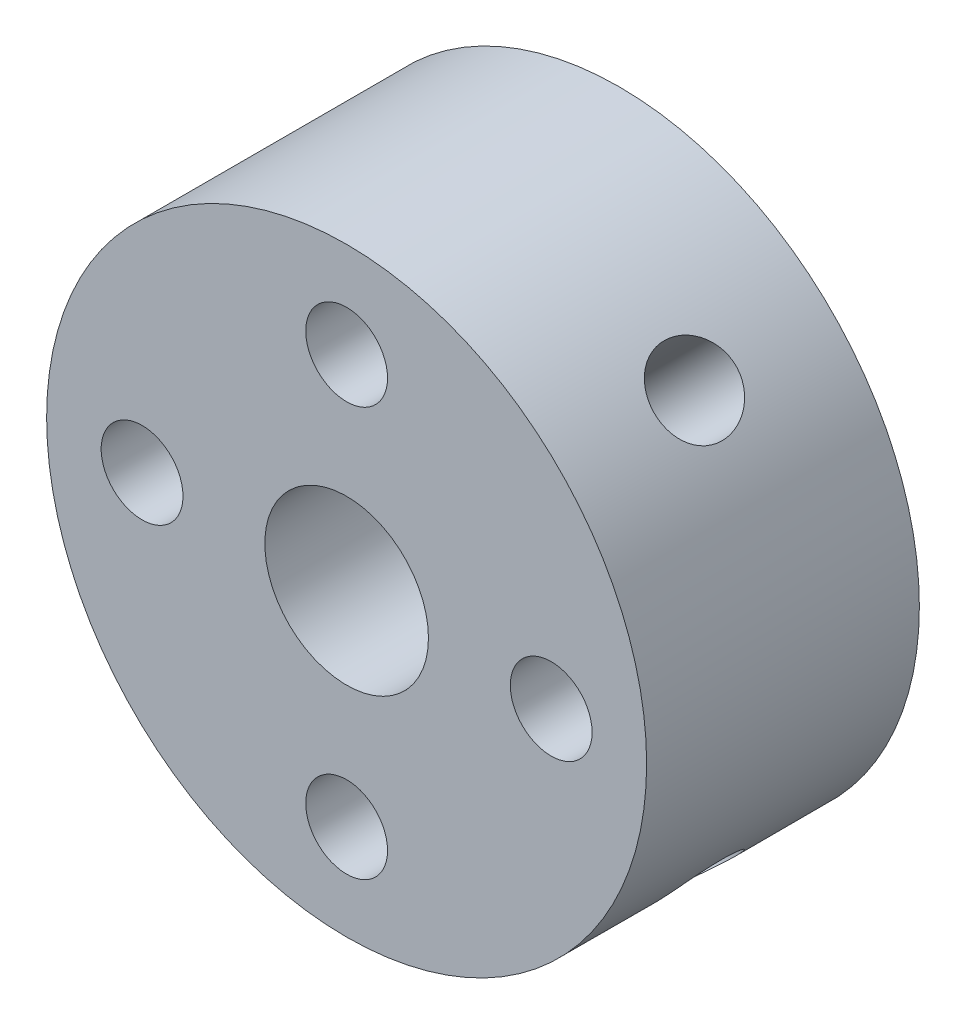
ISO-10303-21;
HEADER;
FILE_DESCRIPTION(('STEP AP214'),'2;1');
FILE_NAME('part.step','',(''),(''),'','','');
FILE_SCHEMA(('AUTOMOTIVE_DESIGN { 1 0 10303 214 1 1 1 1 }'));
ENDSEC;
DATA;
#1=APPLICATION_CONTEXT('core data for automotive mechanical design processes');
#2=APPLICATION_PROTOCOL_DEFINITION('international standard','automotive_design',2000,#1);
#3=PRODUCT_CONTEXT('',#1,'mechanical');
#4=PRODUCT('Part','Part','',(#3));
#5=PRODUCT_RELATED_PRODUCT_CATEGORY('part','',(#4));
#6=PRODUCT_DEFINITION_FORMATION('','',#4);
#7=PRODUCT_DEFINITION_CONTEXT('part definition',#1,'design');
#8=PRODUCT_DEFINITION('design','',#6,#7);
#9=PRODUCT_DEFINITION_SHAPE('','',#8);
#10=(LENGTH_UNIT() NAMED_UNIT(*) SI_UNIT(.MILLI.,.METRE.));
#11=(NAMED_UNIT(*) PLANE_ANGLE_UNIT() SI_UNIT($,.RADIAN.));
#12=(NAMED_UNIT(*) SI_UNIT($,.STERADIAN.) SOLID_ANGLE_UNIT());
#13=UNCERTAINTY_MEASURE_WITH_UNIT(LENGTH_MEASURE(1.E-05),#10,'distance_accuracy_value','');
#14=(GEOMETRIC_REPRESENTATION_CONTEXT(3) GLOBAL_UNCERTAINTY_ASSIGNED_CONTEXT((#13)) GLOBAL_UNIT_ASSIGNED_CONTEXT((#10,
#11,#12)) REPRESENTATION_CONTEXT('',''));
#15=CARTESIAN_POINT('',(0.,0.,0.));
#16=DIRECTION('',(0.,0.,1.));
#17=DIRECTION('',(1.,0.,0.));
#18=AXIS2_PLACEMENT_3D('',#15,#16,#17);
#19=CARTESIAN_POINT('',(0.,0.,10.));
#20=DIRECTION('',(0.,0.,-1.));
#21=DIRECTION('',(-1.,0.,0.));
#22=AXIS2_PLACEMENT_3D('',#19,#20,#21);
#23=CYLINDRICAL_SURFACE('',#22,11.);
#24=CARTESIAN_POINT('',(6.6448573319314,-8.76617767549104,5.));
#25=CARTESIAN_POINT('',(6.64486074059855,-8.76617610186906,4.91616567210925));
#26=CARTESIAN_POINT('',(6.65053526889328,-8.76188267399477,4.83228055723251));
#27=CARTESIAN_POINT('',(6.673022860742,-8.74476745733029,4.66684952531541));
#28=CARTESIAN_POINT('',(6.68984722846946,-8.73193701330325,4.58530606997514));
#29=CARTESIAN_POINT('',(6.73395609145006,-8.69796558065659,4.42697721448577));
#30=CARTESIAN_POINT('',(6.76123308644035,-8.67683055070146,4.35018844840498));
#31=CARTESIAN_POINT('',(6.82519807694267,-8.62660518460868,4.2034580312526));
#32=CARTESIAN_POINT('',(6.86188459958138,-8.59751609347313,4.13351531093468));
#33=CARTESIAN_POINT('',(6.94356872645463,-8.53168290896326,4.00198540501487));
#34=CARTESIAN_POINT('',(6.98861433595897,-8.49489443447096,3.94045023966413));
#35=CARTESIAN_POINT('',(7.08527412119758,-8.41444214919665,3.82793219431433));
#36=CARTESIAN_POINT('',(7.13688863803795,-8.37077798134999,3.77694986265755));
#37=CARTESIAN_POINT('',(7.24513807317181,-8.27726417666745,3.6867955951033));
#38=CARTESIAN_POINT('',(7.30179202342302,-8.22739078003155,3.64767112342807));
#39=CARTESIAN_POINT('',(7.41805962246257,-8.1227152601514,3.58264743189127));
#40=CARTESIAN_POINT('',(7.47767314123403,-8.06791335333601,3.55674763161934));
#41=CARTESIAN_POINT('',(7.59757459559176,-7.95509841029692,3.51906496803403));
#42=CARTESIAN_POINT('',(7.65785603044176,-7.89710746615467,3.50719530414856));
#43=CARTESIAN_POINT('',(7.77762757387922,-7.77917544469371,3.49764061903592));
#44=CARTESIAN_POINT('',(7.83711771903872,-7.71923445794696,3.49995493995034));
#45=CARTESIAN_POINT('',(7.95322515705296,-7.59954722084637,3.51863342758641));
#46=CARTESIAN_POINT('',(8.00985889857549,-7.53980231901211,3.53490422951585));
#47=CARTESIAN_POINT('',(8.11920764350003,-7.42192259766519,3.58088760101573));
#48=CARTESIAN_POINT('',(8.17192256066035,-7.3637878136041,3.61060046630421));
#49=CARTESIAN_POINT('',(8.27235190966067,-7.25078837738725,3.68272220248984));
#50=CARTESIAN_POINT('',(8.32004996891451,-7.19593466982038,3.72517100079362));
#51=CARTESIAN_POINT('',(8.4092407263697,-7.09150151852599,3.82153054945302));
#52=CARTESIAN_POINT('',(8.45073308602924,-7.04192236258558,3.87544192474256));
#53=CARTESIAN_POINT('',(8.52702130868134,-6.94935549455596,3.99371800592032));
#54=CARTESIAN_POINT('',(8.56175997625053,-6.90642465836018,4.05816414750901));
#55=CARTESIAN_POINT('',(8.62348818914968,-6.82919493084726,4.19540195933682));
#56=CARTESIAN_POINT('',(8.65047770109443,-6.79489607671882,4.26819366552872));
#57=CARTESIAN_POINT('',(8.69625679445925,-6.73620891693084,4.42013345080099));
#58=CARTESIAN_POINT('',(8.71504173379227,-6.71182622229743,4.49928509838431));
#59=CARTESIAN_POINT('',(8.74407144283216,-6.67396352274195,4.66165703057244));
#60=CARTESIAN_POINT('',(8.75431670561256,-6.6604828883457,4.74487707997747));
#61=CARTESIAN_POINT('',(8.76604947276433,-6.64503359756101,4.91230884350691));
#62=CARTESIAN_POINT('',(8.76760655579952,-6.64297348163566,4.99650725161949));
#63=CARTESIAN_POINT('',(8.76212409284754,-6.65020309138352,5.16413141793317));
#64=CARTESIAN_POINT('',(8.75508476596082,-6.65949252778578,5.24755719577204));
#65=CARTESIAN_POINT('',(8.73257247662606,-6.68898469651165,5.41092173257889));
#66=CARTESIAN_POINT('',(8.71713392838383,-6.70914289316946,5.49087329274619));
#67=CARTESIAN_POINT('',(8.67809922258499,-6.75955651070175,5.64542172462973));
#68=CARTESIAN_POINT('',(8.65450272743773,-6.7898123494332,5.72001837459578));
#69=CARTESIAN_POINT('',(8.59937130324882,-6.85950378425524,5.86225260622269));
#70=CARTESIAN_POINT('',(8.56778761909163,-6.89899564294171,5.92984371612637));
#71=CARTESIAN_POINT('',(8.49730719894905,-6.98561954275122,6.05567250243432));
#72=CARTESIAN_POINT('',(8.45841012308679,-7.03275193894062,6.11390974390088));
#73=CARTESIAN_POINT('',(8.37374087233468,-7.13335878183969,6.21978152680937));
#74=CARTESIAN_POINT('',(8.32792357136284,-7.18687433140397,6.26734096446248));
#75=CARTESIAN_POINT('',(8.23056743875765,-7.29816538101677,6.3499858890388));
#76=CARTESIAN_POINT('',(8.1790287408288,-7.35594078150536,6.38507166738102));
#77=CARTESIAN_POINT('',(8.07159293484532,-7.47366795409139,6.44165102592852));
#78=CARTESIAN_POINT('',(8.01571003923799,-7.53361231249541,6.46318699364642));
#79=CARTESIAN_POINT('',(7.90087399572786,-7.65395999708465,6.49219300767611));
#80=CARTESIAN_POINT('',(7.84192101416111,-7.71436329825339,6.49966381521964));
#81=CARTESIAN_POINT('',(7.72307365852495,-7.83333560830581,6.50031133277123));
#82=CARTESIAN_POINT('',(7.6631907939784,-7.89191551926262,6.4936034568827));
#83=CARTESIAN_POINT('',(7.54378053203807,-8.00613540184092,6.4663297343614));
#84=CARTESIAN_POINT('',(7.48425313404464,-8.06177537842317,6.44576391111301));
#85=CARTESIAN_POINT('',(7.36742157079426,-8.16868236181451,6.39139640720433));
#86=CARTESIAN_POINT('',(7.31011631137833,-8.21995153605947,6.35760133383509));
#87=CARTESIAN_POINT('',(7.19953146428841,-8.31698050798136,6.27774669775951));
#88=CARTESIAN_POINT('',(7.14625196090209,-8.36274019031737,6.23168687835617));
#89=CARTESIAN_POINT('',(7.04509103434485,-8.44814272427129,6.12818721327756));
#90=CARTESIAN_POINT('',(6.99725476711428,-8.48773528961639,6.07066173203946));
#91=CARTESIAN_POINT('',(6.90912286528557,-8.55962993641549,5.94604312200913));
#92=CARTESIAN_POINT('',(6.86882901083432,-8.5919302971461,5.87894774111351));
#93=CARTESIAN_POINT('',(6.79709875563883,-8.64878947865355,5.73673515331394));
#94=CARTESIAN_POINT('',(6.76570396622854,-8.67331199230183,5.66158245417127));
#95=CARTESIAN_POINT('',(6.71325461497686,-8.71397289069608,5.50567620765006));
#96=CARTESIAN_POINT('',(6.69218902940461,-8.730120214841,5.42492873677124));
#97=CARTESIAN_POINT('',(6.66614434978255,-8.75001068416757,5.2864886017611));
#98=CARTESIAN_POINT('',(6.65817700505846,-8.7560678447395,5.22966178880317));
#99=CARTESIAN_POINT('',(6.64753235031211,-8.76415186164646,5.11523131143772));
#100=CARTESIAN_POINT('',(6.64485498881614,-8.76617875719762,5.0576276545947));
#101=CARTESIAN_POINT('',(6.6448573319314,-8.76617767549104,5.));
#102=B_SPLINE_CURVE_WITH_KNOTS('',3,(#24,#25,#26,#27,#28,#29,#30,#31,#32,#33,#34,#35,#36,#37,
#38,#39,#40,#41,#42,#43,#44,#45,#46,#47,#48,#49,#50,#51,#52,#53,#54,#55,#56,#57,#58,#59,#60,#61,
#62,#63,#64,#65,#66,#67,#68,#69,#70,#71,#72,#73,#74,#75,#76,#77,#78,#79,#80,#81,#82,#83,#84,#85,
#86,#87,#88,#89,#90,#91,#92,#93,#94,#95,#96,#97,#98,#99,#100,#101),.UNSPECIFIED.,.T.,.F.,(4,2,2,
2,2,2,2,2,2,2,2,2,2,2,2,2,2,2,2,2,2,2,2,2,2,2,2,2,2,2,2,2,2,2,2,2,2,2,4),(0.,0.251292413652353,
0.502839988614745,0.754207403054465,1.00553549494109,1.25835430174809,1.51118624213233,
1.76501723524539,2.01883708715133,2.27107826705026,2.52330774799944,2.77386293073417,
3.02442362581396,3.27577819064359,3.52714646271321,3.78055871311719,4.03397205526462,
4.28752859167035,4.5410704869265,4.7925789637682,5.04408103043815,5.29456029222846,
5.5450499205463,5.79710712919646,6.04917605465383,6.30296596167166,6.55674993906902,
6.80973601099935,7.0627083904752,7.31362951480923,7.56455021573112,7.81534575497388,
8.06614654369507,8.31889590223292,8.57170483921673,8.82567709259417,9.07937770366513,
9.2521176026127,9.42485582072184),.UNSPECIFIED.);
#103=CARTESIAN_POINT('',(6.6448573319314,-8.76617767549104,5.));
#104=VERTEX_POINT('',#103);
#105=EDGE_CURVE('E81',#104,#104,#102,.T.);
#106=ORIENTED_EDGE('',*,*,#105,.F.);
#107=EDGE_LOOP('',(#106));
#108=FACE_BOUND('',#107,.T.);
#109=CARTESIAN_POINT('',(0.,0.,10.));
#110=DIRECTION('',(0.,0.,1.));
#111=DIRECTION('',(1.,0.,0.));
#112=AXIS2_PLACEMENT_3D('',#109,#110,#111);
#113=CIRCLE('',#112,11.);
#114=CARTESIAN_POINT('',(11.,0.,10.));
#115=VERTEX_POINT('',#114);
#116=EDGE_CURVE('E10',#115,#115,#113,.T.);
#117=ORIENTED_EDGE('',*,*,#116,.F.);
#118=EDGE_LOOP('',(#117));
#119=FACE_BOUND('',#118,.T.);
#120=CARTESIAN_POINT('',(0.,0.,0.));
#121=DIRECTION('',(0.,0.,1.));
#122=DIRECTION('',(1.,0.,0.));
#123=AXIS2_PLACEMENT_3D('',#120,#121,#122);
#124=CIRCLE('',#123,11.);
#125=CARTESIAN_POINT('',(11.,0.,0.));
#126=VERTEX_POINT('',#125);
#127=EDGE_CURVE('E34',#126,#126,#124,.T.);
#128=ORIENTED_EDGE('',*,*,#127,.T.);
#129=EDGE_LOOP('',(#128));
#130=FACE_BOUND('',#129,.T.);
#131=CARTESIAN_POINT('',(8.76617767549104,6.6448573319314,5.));
#132=CARTESIAN_POINT('',(8.76617610186906,6.64486074059855,5.08383432789075));
#133=CARTESIAN_POINT('',(8.76188267399477,6.65053526889328,5.16771944276748));
#134=CARTESIAN_POINT('',(8.74476745733029,6.673022860742,5.33315047468459));
#135=CARTESIAN_POINT('',(8.73193701330325,6.68984722846946,5.41469393002486));
#136=CARTESIAN_POINT('',(8.69796558065659,6.73395609145006,5.57302278551422));
#137=CARTESIAN_POINT('',(8.67683055070146,6.76123308644035,5.64981155159501));
#138=CARTESIAN_POINT('',(8.62660518460868,6.82519807694267,5.7965419687474));
#139=CARTESIAN_POINT('',(8.59751609347313,6.86188459958138,5.86648468906532));
#140=CARTESIAN_POINT('',(8.53168290896326,6.94356872645463,5.99801459498512));
#141=CARTESIAN_POINT('',(8.49489443447096,6.98861433595898,6.05954976033587));
#142=CARTESIAN_POINT('',(8.41444214919665,7.08527412119758,6.17206780568567));
#143=CARTESIAN_POINT('',(8.37077798134999,7.13688863803795,6.22305013734244));
#144=CARTESIAN_POINT('',(8.27726417666745,7.24513807317182,6.31320440489669));
#145=CARTESIAN_POINT('',(8.22739078003155,7.30179202342302,6.35232887657192));
#146=CARTESIAN_POINT('',(8.1227152601514,7.41805962246258,6.41735256810873));
#147=CARTESIAN_POINT('',(8.06791335333601,7.47767314123403,6.44325236838065));
#148=CARTESIAN_POINT('',(7.95509841029692,7.59757459559176,6.48093503196597));
#149=CARTESIAN_POINT('',(7.89710746615466,7.65785603044176,6.49280469585143));
#150=CARTESIAN_POINT('',(7.77917544469371,7.77762757387922,6.50235938096407));
#151=CARTESIAN_POINT('',(7.71923445794696,7.83711771903873,6.50004506004966));
#152=CARTESIAN_POINT('',(7.59954722084637,7.95322515705296,6.48136657241359));
#153=CARTESIAN_POINT('',(7.53980231901211,8.00985889857549,6.46509577048414));
#154=CARTESIAN_POINT('',(7.42192259766519,8.11920764350004,6.41911239898426));
#155=CARTESIAN_POINT('',(7.36378781360409,8.17192256066035,6.38939953369579));
#156=CARTESIAN_POINT('',(7.25078837738725,8.27235190966067,6.31727779751015));
#157=CARTESIAN_POINT('',(7.19593466982038,8.32004996891452,6.27482899920637));
#158=CARTESIAN_POINT('',(7.09150151852599,8.40924072636971,6.17846945054698));
#159=CARTESIAN_POINT('',(7.04192236258557,8.45073308602925,6.12455807525743));
#160=CARTESIAN_POINT('',(6.94935549455596,8.52702130868134,6.00628199407967));
#161=CARTESIAN_POINT('',(6.90642465836018,8.56175997625053,5.94183585249098));
#162=CARTESIAN_POINT('',(6.82919493084726,8.62348818914968,5.80459804066317));
#163=CARTESIAN_POINT('',(6.79489607671882,8.65047770109443,5.73180633447127));
#164=CARTESIAN_POINT('',(6.73620891693084,8.69625679445925,5.579866549199));
#165=CARTESIAN_POINT('',(6.71182622229742,8.71504173379227,5.50071490161568));
#166=CARTESIAN_POINT('',(6.67396352274195,8.74407144283216,5.33834296942756));
#167=CARTESIAN_POINT('',(6.66048288834569,8.75431670561257,5.25512292002253));
#168=CARTESIAN_POINT('',(6.64503359756101,8.76604947276434,5.08769115649309));
#169=CARTESIAN_POINT('',(6.64297348163566,8.76760655579952,5.00349274838051));
#170=CARTESIAN_POINT('',(6.65020309138352,8.76212409284755,4.83586858206682));
#171=CARTESIAN_POINT('',(6.65949252778577,8.75508476596082,4.75244280422796));
#172=CARTESIAN_POINT('',(6.68898469651164,8.73257247662606,4.5890782674211));
#173=CARTESIAN_POINT('',(6.70914289316946,8.71713392838383,4.50912670725381));
#174=CARTESIAN_POINT('',(6.75955651070175,8.67809922258499,4.35457827537026));
#175=CARTESIAN_POINT('',(6.7898123494332,8.65450272743773,4.27998162540421));
#176=CARTESIAN_POINT('',(6.85950378425524,8.59937130324882,4.1377473937773));
#177=CARTESIAN_POINT('',(6.89899564294171,8.56778761909164,4.07015628387363));
#178=CARTESIAN_POINT('',(6.98561954275121,8.49730719894906,3.94432749756567));
#179=CARTESIAN_POINT('',(7.03275193894061,8.45841012308679,3.88609025609912));
#180=CARTESIAN_POINT('',(7.13335878183969,8.37374087233469,3.78021847319063));
#181=CARTESIAN_POINT('',(7.18687433140397,8.32792357136284,3.73265903553752));
#182=CARTESIAN_POINT('',(7.29816538101677,8.23056743875765,3.6500141109612));
#183=CARTESIAN_POINT('',(7.35594078150536,8.1790287408288,3.61492833261897));
#184=CARTESIAN_POINT('',(7.47366795409138,8.07159293484532,3.55834897407147));
#185=CARTESIAN_POINT('',(7.53361231249541,8.01571003923799,3.53681300635357));
#186=CARTESIAN_POINT('',(7.65395999708465,7.90087399572786,3.50780699232389));
#187=CARTESIAN_POINT('',(7.71436329825339,7.84192101416111,3.50033618478036));
#188=CARTESIAN_POINT('',(7.8333356083058,7.72307365852495,3.49968866722877));
#189=CARTESIAN_POINT('',(7.89191551926262,7.6631907939784,3.50639654311729));
#190=CARTESIAN_POINT('',(8.00613540184092,7.54378053203807,3.5336702656386));
#191=CARTESIAN_POINT('',(8.06177537842317,7.48425313404464,3.55423608888699));
#192=CARTESIAN_POINT('',(8.1686823618145,7.36742157079426,3.60860359279566));
#193=CARTESIAN_POINT('',(8.21995153605947,7.31011631137834,3.6423986661649));
#194=CARTESIAN_POINT('',(8.31698050798136,7.19953146428841,3.72225330224049));
#195=CARTESIAN_POINT('',(8.36274019031737,7.14625196090209,3.76831312164382));
#196=CARTESIAN_POINT('',(8.44814272427129,7.04509103434485,3.87181278672243));
#197=CARTESIAN_POINT('',(8.48773528961638,6.99725476711428,3.92933826796054));
#198=CARTESIAN_POINT('',(8.55962993641549,6.90912286528558,4.05395687799086));
#199=CARTESIAN_POINT('',(8.5919302971461,6.86882901083432,4.12105225888649));
#200=CARTESIAN_POINT('',(8.64878947865354,6.79709875563883,4.26326484668606));
#201=CARTESIAN_POINT('',(8.67331199230183,6.76570396622854,4.33841754582872));
#202=CARTESIAN_POINT('',(8.71397289069608,6.71325461497686,4.49432379234994));
#203=CARTESIAN_POINT('',(8.730120214841,6.69218902940461,4.57507126322876));
#204=CARTESIAN_POINT('',(8.75001068416756,6.66614434978255,4.71351139823889));
#205=CARTESIAN_POINT('',(8.75606784473949,6.65817700505846,4.77033821119682));
#206=CARTESIAN_POINT('',(8.76415186164645,6.64753235031211,4.88476868856227));
#207=CARTESIAN_POINT('',(8.76617875719762,6.64485498881614,4.9423723454053));
#208=CARTESIAN_POINT('',(8.76617767549104,6.6448573319314,5.));
#209=B_SPLINE_CURVE_WITH_KNOTS('',3,(#131,#132,#133,#134,#135,#136,#137,#138,#139,#140,#141,
#142,#143,#144,#145,#146,#147,#148,#149,#150,#151,#152,#153,#154,#155,#156,#157,#158,#159,#160,
#161,#162,#163,#164,#165,#166,#167,#168,#169,#170,#171,#172,#173,#174,#175,#176,#177,#178,#179,
#180,#181,#182,#183,#184,#185,#186,#187,#188,#189,#190,#191,#192,#193,#194,#195,#196,#197,#198,
#199,#200,#201,#202,#203,#204,#205,#206,#207,#208),.UNSPECIFIED.,.T.,.F.,(4,2,2,2,2,2,2,2,2,2,2,
2,2,2,2,2,2,2,2,2,2,2,2,2,2,2,2,2,2,2,2,2,2,2,2,2,2,2,4),(0.,0.251292413652353,
0.502839988614745,0.754207403054465,1.00553549494109,1.25835430174809,1.51118624213233,
1.76501723524539,2.01883708715133,2.27107826705026,2.52330774799944,2.77386293073417,
3.02442362581396,3.27577819064359,3.52714646271321,3.78055871311719,4.03397205526462,
4.28752859167035,4.5410704869265,4.79257896376821,5.04408103043815,5.29456029222846,
5.5450499205463,5.79710712919646,6.04917605465383,6.30296596167166,6.55674993906903,
6.80973601099935,7.0627083904752,7.31362951480923,7.56455021573112,7.81534575497388,
8.06614654369507,8.31889590223293,8.57170483921673,8.82567709259417,9.07937770366513,
9.25211760261269,9.42485582072184),.UNSPECIFIED.);
#210=CARTESIAN_POINT('',(8.76617767549104,6.6448573319314,5.));
#211=VERTEX_POINT('',#210);
#212=EDGE_CURVE('E73',#211,#211,#209,.T.);
#213=ORIENTED_EDGE('',*,*,#212,.T.);
#214=EDGE_LOOP('',(#213));
#215=FACE_BOUND('',#214,.T.);
#216=ADVANCED_FACE('F31',(#108,#119,#130,#215),#23,.T.);
#217=CARTESIAN_POINT('',(0.,0.,10.));
#218=DIRECTION('',(0.,0.,-1.));
#219=DIRECTION('',(-1.,0.,0.));
#220=AXIS2_PLACEMENT_3D('',#217,#218,#219);
#221=CYLINDRICAL_SURFACE('',#220,3.);
#222=CARTESIAN_POINT('',(0.776457135307563,-2.89777747886721,5.));
#223=CARTESIAN_POINT('',(0.776465807945205,-2.89777843642086,4.92183828770712));
#224=CARTESIAN_POINT('',(0.783337885586098,-2.89596075365292,4.84357788271243));
#225=CARTESIAN_POINT('',(0.810238787422554,-2.88854556363685,4.68945910298427));
#226=CARTESIAN_POINT('',(0.830295257550601,-2.88294011324794,4.61360612743488));
#227=CARTESIAN_POINT('',(0.881825990933505,-2.86759385571556,4.46682250348409));
#228=CARTESIAN_POINT('',(0.913239525995621,-2.85787499736417,4.39586802128962));
#229=CARTESIAN_POINT('',(0.98552207479157,-2.83375960105533,4.25986369700492));
#230=CARTESIAN_POINT('',(1.02639160004348,-2.81936281002992,4.19481417460631));
#231=CARTESIAN_POINT('',(1.11931695974479,-2.78384605508351,4.06654140716374));
#232=CARTESIAN_POINT('',(1.17201739854081,-2.7622695134035,4.00391129648968));
#233=CARTESIAN_POINT('',(1.28389309696414,-2.7120800954357,3.88788741738993));
#234=CARTESIAN_POINT('',(1.34307156240821,-2.68346372649268,3.83449825612472));
#235=CARTESIAN_POINT('',(1.46978353515751,-2.61633504151045,3.7349492732785));
#236=CARTESIAN_POINT('',(1.53761134146163,-2.57728569203884,3.6895193482107));
#237=CARTESIAN_POINT('',(1.67515420911279,-2.4900743247597,3.61228872013135));
#238=CARTESIAN_POINT('',(1.74486804977896,-2.44191808567332,3.58047941579424));
#239=CARTESIAN_POINT('',(1.87817425418938,-2.34071742954988,3.53374300804835));
#240=CARTESIAN_POINT('',(1.94184923030434,-2.28826464060798,3.5177757104667));
#241=CARTESIAN_POINT('',(2.06564121032913,-2.1771603544596,3.49975082198744));
#242=CARTESIAN_POINT('',(2.12576034519837,-2.11851262971613,3.49768481480643));
#243=CARTESIAN_POINT('',(2.23530137136982,-2.00231140292521,3.50712001095552));
#244=CARTESIAN_POINT('',(2.28519887174933,-1.94510625043172,3.51745702328183));
#245=CARTESIAN_POINT('',(2.37912040040672,-1.8290328206712,3.54932126585698));
#246=CARTESIAN_POINT('',(2.42314398886576,-1.77016441926511,3.57084933346433));
#247=CARTESIAN_POINT('',(2.50530608030927,-1.65187898356767,3.62462384913472));
#248=CARTESIAN_POINT('',(2.54335473361967,-1.59246562724667,3.6570144697581));
#249=CARTESIAN_POINT('',(2.61278069336991,-1.47580220064365,3.73139512430224));
#250=CARTESIAN_POINT('',(2.64415560358889,-1.41855291342132,3.77338859495352));
#251=CARTESIAN_POINT('',(2.70321718660422,-1.30277736945863,3.87034302729952));
#252=CARTESIAN_POINT('',(2.73027487166611,-1.2446419510183,3.92615454248901));
#253=CARTESIAN_POINT('',(2.77749540009897,-1.13537205134786,4.04688458739526));
#254=CARTESIAN_POINT('',(2.79765294762602,-1.08424296543308,4.11181005841109));
#255=CARTESIAN_POINT('',(2.83296699306694,-0.988467637856777,4.25397228863613));
#256=CARTESIAN_POINT('',(2.84772461492292,-0.944439272066018,4.33172903458131));
#257=CARTESIAN_POINT('',(2.87128516634125,-0.870203141463101,4.49440650703849));
#258=CARTESIAN_POINT('',(2.88009431275189,-0.83998095830825,4.57931964952634));
#259=CARTESIAN_POINT('',(2.8920242052622,-0.797898740855283,4.74682176692418));
#260=CARTESIAN_POINT('',(2.89554041189933,-0.784773377993308,4.82906167856533));
#261=CARTESIAN_POINT('',(2.89846195751578,-0.773923684249223,4.99460201227481));
#262=CARTESIAN_POINT('',(2.89787020033614,-0.776188474338463,5.07790164367968));
#263=CARTESIAN_POINT('',(2.89282271219333,-0.794760432934035,5.23348087786809));
#264=CARTESIAN_POINT('',(2.88879674637904,-0.809504390277578,5.30596917666189));
#265=CARTESIAN_POINT('',(2.87718549622091,-0.849847525365751,5.44755167940644));
#266=CARTESIAN_POINT('',(2.86959905914146,-0.875450218468109,5.51664477611991));
#267=CARTESIAN_POINT('',(2.85000428601381,-0.93732091358477,5.65311699635404));
#268=CARTESIAN_POINT('',(2.83780742241691,-0.974027961374805,5.72026852528033));
#269=CARTESIAN_POINT('',(2.80846718922543,-1.05564763070854,5.84820390730849));
#270=CARTESIAN_POINT('',(2.79132127696574,-1.10056446582024,5.90898446526992));
#271=CARTESIAN_POINT('',(2.74893115939282,-1.20283404947151,6.03046815128532));
#272=CARTESIAN_POINT('',(2.72293857041294,-1.26104068458325,6.09019572607649));
#273=CARTESIAN_POINT('',(2.66304918010131,-1.38303494861758,6.19911835699038));
#274=CARTESIAN_POINT('',(2.62914971686415,-1.44682445252411,6.24830985534581));
#275=CARTESIAN_POINT('',(2.55189425785636,-1.57919386501897,6.33586058892515));
#276=CARTESIAN_POINT('',(2.50831229866665,-1.64785576996501,6.37389967731636));
#277=CARTESIAN_POINT('',(2.41231873467998,-1.78542113059001,6.43570685578609));
#278=CARTESIAN_POINT('',(2.35991493507781,-1.85432432047734,6.45948747704946));
#279=CARTESIAN_POINT('',(2.25247602694357,-1.98311144359732,6.49005284626199));
#280=CARTESIAN_POINT('',(2.19812351338379,-2.04324285223115,6.49819681381417));
#281=CARTESIAN_POINT('',(2.08451046937594,-2.15902393796182,6.5012648981816));
#282=CARTESIAN_POINT('',(2.02525166408007,-2.21467517691624,6.49619364278534));
#283=CARTESIAN_POINT('',(1.90791731594304,-2.31635207595353,6.47387538980656));
#284=CARTESIAN_POINT('',(1.85002110919703,-2.36277036625902,6.45745272611349));
#285=CARTESIAN_POINT('',(1.73362251777721,-2.44945348099617,6.41400950104554));
#286=CARTESIAN_POINT('',(1.67512004734522,-2.48971742182762,6.38698741985982));
#287=CARTESIAN_POINT('',(1.5568750791499,-2.56540042262159,6.32190942175104));
#288=CARTESIAN_POINT('',(1.49718656380225,-2.60053861020872,6.28343101518824));
#289=CARTESIAN_POINT('',(1.38109270507128,-2.66401345602037,6.19706310371142));
#290=CARTESIAN_POINT('',(1.32468888511395,-2.69234697700719,6.14916927632649));
#291=CARTESIAN_POINT('',(1.21166858581717,-2.74520076947935,6.03980429146594));
#292=CARTESIAN_POINT('',(1.15558958126822,-2.76906092274574,5.97745626878421));
#293=CARTESIAN_POINT('',(1.05214039162087,-2.8100006811322,5.84382391830534));
#294=CARTESIAN_POINT('',(1.00477791984151,-2.8270742961439,5.77253176869847));
#295=CARTESIAN_POINT('',(0.920191613571826,-2.85575022521723,5.62004503012856));
#296=CARTESIAN_POINT('',(0.883335479265525,-2.86716258468163,5.53860870330689));
#297=CARTESIAN_POINT('',(0.824963295294622,-2.88450805289951,5.37000139349033));
#298=CARTESIAN_POINT('',(0.80339595495462,-2.89045950183027,5.28285066663097));
#299=CARTESIAN_POINT('',(0.785870399492768,-2.89524136224008,5.162291966522));
#300=CARTESIAN_POINT('',(0.782348442320771,-2.89619347565166,5.12994815840317));
#301=CARTESIAN_POINT('',(0.777639926487407,-2.89746135588973,5.06507527897663));
#302=CARTESIAN_POINT('',(0.776453524059149,-2.89777708014605,5.03254619542119));
#303=CARTESIAN_POINT('',(0.776457135307563,-2.89777747886721,5.));
#304=B_SPLINE_CURVE_WITH_KNOTS('',3,(#222,#223,#224,#225,#226,#227,#228,#229,#230,#231,#232,
#233,#234,#235,#236,#237,#238,#239,#240,#241,#242,#243,#244,#245,#246,#247,#248,#249,#250,#251,
#252,#253,#254,#255,#256,#257,#258,#259,#260,#261,#262,#263,#264,#265,#266,#267,#268,#269,#270,
#271,#272,#273,#274,#275,#276,#277,#278,#279,#280,#281,#282,#283,#284,#285,#286,#287,#288,#289,
#290,#291,#292,#293,#294,#295,#296,#297,#298,#299,#300,#301,#302,#303),.UNSPECIFIED.,.T.,.F.,(4,
2,2,2,2,2,2,2,2,2,2,2,2,2,2,2,2,2,2,2,2,2,2,2,2,2,2,2,2,2,2,2,2,2,2,2,2,2,2,2,4),(0.,
0.234348183892073,0.469189339237207,0.702792893878328,0.936409088167725,1.18929346874735,
1.44230356626556,1.71236838358145,1.98226240445837,2.23295227451903,2.4834903552906,
2.71224146226808,2.94100968776183,3.1729430209672,3.40495949025408,3.65890787185336,
3.91305072368878,4.18333262594173,4.45333161317557,4.70193436281318,4.9503613978256,
5.17161275136039,5.39293578654095,5.62450944609132,5.85620229330071,6.1171011537092,
6.37808797467303,6.64596272119449,6.91360169713157,7.1566840558423,7.39968130190957,
7.62666637307239,7.8536840026802,8.09041126079208,8.32724745151079,8.58765362775102,
8.84828914267731,9.11716123557907,9.3851269950414,9.48270202777964,9.58028358741811),.UNSPECIFIED.);
#305=CARTESIAN_POINT('',(0.776457135307563,-2.89777747886721,5.));
#306=VERTEX_POINT('',#305);
#307=EDGE_CURVE('E102',#306,#306,#304,.T.);
#308=ORIENTED_EDGE('',*,*,#307,.T.);
#309=EDGE_LOOP('',(#308));
#310=FACE_BOUND('',#309,.T.);
#311=CARTESIAN_POINT('',(0.,0.,0.));
#312=DIRECTION('',(0.,0.,1.));
#313=DIRECTION('',(1.,0.,0.));
#314=AXIS2_PLACEMENT_3D('',#311,#312,#313);
#315=CIRCLE('',#314,3.);
#316=CARTESIAN_POINT('',(3.,0.,0.));
#317=VERTEX_POINT('',#316);
#318=EDGE_CURVE('E43',#317,#317,#315,.T.);
#319=ORIENTED_EDGE('',*,*,#318,.F.);
#320=EDGE_LOOP('',(#319));
#321=FACE_BOUND('',#320,.T.);
#322=CARTESIAN_POINT('',(0.,0.,10.));
#323=DIRECTION('',(0.,0.,1.));
#324=DIRECTION('',(1.,0.,0.));
#325=AXIS2_PLACEMENT_3D('',#322,#323,#324);
#326=CIRCLE('',#325,3.);
#327=CARTESIAN_POINT('',(3.,0.,10.));
#328=VERTEX_POINT('',#327);
#329=EDGE_CURVE('E41',#328,#328,#326,.T.);
#330=ORIENTED_EDGE('',*,*,#329,.T.);
#331=EDGE_LOOP('',(#330));
#332=FACE_BOUND('',#331,.T.);
#333=CARTESIAN_POINT('',(2.89777747886721,0.776457135307563,5.));
#334=CARTESIAN_POINT('',(2.89777843642086,0.776465807945205,5.07816171229287));
#335=CARTESIAN_POINT('',(2.89596075365292,0.783337885586098,5.15642211728756));
#336=CARTESIAN_POINT('',(2.88854556363685,0.810238787422554,5.31054089701573));
#337=CARTESIAN_POINT('',(2.88294011324794,0.830295257550602,5.38639387256511));
#338=CARTESIAN_POINT('',(2.86759385571556,0.881825990933506,5.53317749651591));
#339=CARTESIAN_POINT('',(2.85787499736417,0.913239525995621,5.60413197871038));
#340=CARTESIAN_POINT('',(2.83375960105533,0.985522074791568,5.74013630299508));
#341=CARTESIAN_POINT('',(2.81936281002992,1.02639160004348,5.80518582539368));
#342=CARTESIAN_POINT('',(2.78384605508351,1.11931695974479,5.93345859283626));
#343=CARTESIAN_POINT('',(2.7622695134035,1.17201739854081,5.99608870351031));
#344=CARTESIAN_POINT('',(2.7120800954357,1.28389309696414,6.11211258261006));
#345=CARTESIAN_POINT('',(2.68346372649268,1.34307156240821,6.16550174387528));
#346=CARTESIAN_POINT('',(2.61633504151045,1.4697835351575,6.26505072672149));
#347=CARTESIAN_POINT('',(2.57728569203884,1.53761134146163,6.31048065178929));
#348=CARTESIAN_POINT('',(2.4900743247597,1.67515420911279,6.38771127986864));
#349=CARTESIAN_POINT('',(2.44191808567332,1.74486804977896,6.41952058420575));
#350=CARTESIAN_POINT('',(2.34071742954988,1.87817425418938,6.46625699195164));
#351=CARTESIAN_POINT('',(2.28826464060798,1.94184923030434,6.4822242895333));
#352=CARTESIAN_POINT('',(2.1771603544596,2.06564121032913,6.50024917801256));
#353=CARTESIAN_POINT('',(2.11851262971613,2.12576034519838,6.50231518519356));
#354=CARTESIAN_POINT('',(2.00231140292521,2.23530137136982,6.49287998904447));
#355=CARTESIAN_POINT('',(1.94510625043172,2.28519887174933,6.48254297671816));
#356=CARTESIAN_POINT('',(1.8290328206712,2.37912040040672,6.45067873414301));
#357=CARTESIAN_POINT('',(1.77016441926511,2.42314398886576,6.42915066653566));
#358=CARTESIAN_POINT('',(1.65187898356767,2.50530608030927,6.37537615086528));
#359=CARTESIAN_POINT('',(1.59246562724667,2.54335473361967,6.3429855302419));
#360=CARTESIAN_POINT('',(1.47580220064365,2.61278069336991,6.26860487569776));
#361=CARTESIAN_POINT('',(1.41855291342132,2.64415560358889,6.22661140504647));
#362=CARTESIAN_POINT('',(1.30277736945863,2.70321718660422,6.12965697270048));
#363=CARTESIAN_POINT('',(1.2446419510183,2.73027487166611,6.07384545751098));
#364=CARTESIAN_POINT('',(1.13537205134786,2.77749540009897,5.95311541260473));
#365=CARTESIAN_POINT('',(1.08424296543308,2.79765294762602,5.8881899415889));
#366=CARTESIAN_POINT('',(0.988467637856778,2.83296699306694,5.74602771136386));
#367=CARTESIAN_POINT('',(0.944439272066018,2.84772461492292,5.66827096541868));
#368=CARTESIAN_POINT('',(0.870203141463101,2.87128516634125,5.5055934929615));
#369=CARTESIAN_POINT('',(0.839980958308249,2.88009431275189,5.42068035047365));
#370=CARTESIAN_POINT('',(0.797898740855281,2.8920242052622,5.25317823307581));
#371=CARTESIAN_POINT('',(0.784773377993307,2.89554041189933,5.17093832143467));
#372=CARTESIAN_POINT('',(0.773923684249222,2.89846195751578,5.00539798772518));
#373=CARTESIAN_POINT('',(0.776188474338462,2.89787020033614,4.92209835632032));
#374=CARTESIAN_POINT('',(0.794760432934032,2.89282271219333,4.7665191221319));
#375=CARTESIAN_POINT('',(0.809504390277574,2.88879674637904,4.69403082333811));
#376=CARTESIAN_POINT('',(0.849847525365746,2.87718549622091,4.55244832059356));
#377=CARTESIAN_POINT('',(0.875450218468105,2.86959905914146,4.48335522388008));
#378=CARTESIAN_POINT('',(0.937320913584767,2.85000428601381,4.34688300364595));
#379=CARTESIAN_POINT('',(0.974027961374801,2.83780742241691,4.27973147471967));
#380=CARTESIAN_POINT('',(1.05564763070854,2.80846718922543,4.15179609269151));
#381=CARTESIAN_POINT('',(1.10056446582024,2.79132127696574,4.09101553473007));
#382=CARTESIAN_POINT('',(1.20283404947151,2.74893115939282,3.96953184871468));
#383=CARTESIAN_POINT('',(1.26104068458325,2.72293857041294,3.90980427392351));
#384=CARTESIAN_POINT('',(1.38303494861758,2.66304918010131,3.80088164300961));
#385=CARTESIAN_POINT('',(1.4468244525241,2.62914971686415,3.75169014465419));
#386=CARTESIAN_POINT('',(1.57919386501897,2.55189425785636,3.66413941107484));
#387=CARTESIAN_POINT('',(1.647855769965,2.50831229866665,3.62610032268363));
#388=CARTESIAN_POINT('',(1.78542113059001,2.41231873467998,3.56429314421391));
#389=CARTESIAN_POINT('',(1.85432432047734,2.35991493507781,3.54051252295054));
#390=CARTESIAN_POINT('',(1.98311144359732,2.25247602694357,3.509947153738));
#391=CARTESIAN_POINT('',(2.04324285223115,2.19812351338379,3.50180318618583));
#392=CARTESIAN_POINT('',(2.15902393796182,2.08451046937594,3.49873510181839));
#393=CARTESIAN_POINT('',(2.21467517691624,2.02525166408007,3.50380635721465));
#394=CARTESIAN_POINT('',(2.31635207595353,1.90791731594304,3.52612461019343));
#395=CARTESIAN_POINT('',(2.36277036625902,1.85002110919703,3.5425472738865));
#396=CARTESIAN_POINT('',(2.44945348099617,1.73362251777721,3.58599049895445));
#397=CARTESIAN_POINT('',(2.48971742182762,1.67512004734522,3.61301258014018));
#398=CARTESIAN_POINT('',(2.56540042262159,1.5568750791499,3.67809057824896));
#399=CARTESIAN_POINT('',(2.60053861020872,1.49718656380225,3.71656898481176));
#400=CARTESIAN_POINT('',(2.66401345602037,1.38109270507128,3.80293689628857));
#401=CARTESIAN_POINT('',(2.69234697700719,1.32468888511395,3.85083072367351));
#402=CARTESIAN_POINT('',(2.74520076947935,1.21166858581718,3.96019570853405));
#403=CARTESIAN_POINT('',(2.76906092274574,1.15558958126822,4.02254373121579));
#404=CARTESIAN_POINT('',(2.8100006811322,1.05214039162087,4.15617608169465));
#405=CARTESIAN_POINT('',(2.8270742961439,1.00477791984151,4.22746823130152));
#406=CARTESIAN_POINT('',(2.85575022521723,0.920191613571826,4.37995496987143));
#407=CARTESIAN_POINT('',(2.86716258468163,0.883335479265525,4.4613912966931));
#408=CARTESIAN_POINT('',(2.88450805289951,0.824963295294623,4.62999860650967));
#409=CARTESIAN_POINT('',(2.89045950183027,0.803395954954622,4.71714933336903));
#410=CARTESIAN_POINT('',(2.89524136224008,0.785870399492769,4.83770803347799));
#411=CARTESIAN_POINT('',(2.89619347565166,0.782348442320772,4.87005184159682));
#412=CARTESIAN_POINT('',(2.89746135588973,0.777639926487408,4.93492472102336));
#413=CARTESIAN_POINT('',(2.89777708014605,0.77645352405915,4.96745380457881));
#414=CARTESIAN_POINT('',(2.89777747886721,0.776457135307563,5.));
#415=B_SPLINE_CURVE_WITH_KNOTS('',3,(#333,#334,#335,#336,#337,#338,#339,#340,#341,#342,#343,
#344,#345,#346,#347,#348,#349,#350,#351,#352,#353,#354,#355,#356,#357,#358,#359,#360,#361,#362,
#363,#364,#365,#366,#367,#368,#369,#370,#371,#372,#373,#374,#375,#376,#377,#378,#379,#380,#381,
#382,#383,#384,#385,#386,#387,#388,#389,#390,#391,#392,#393,#394,#395,#396,#397,#398,#399,#400,
#401,#402,#403,#404,#405,#406,#407,#408,#409,#410,#411,#412,#413,#414),.UNSPECIFIED.,.T.,.F.,(4,
2,2,2,2,2,2,2,2,2,2,2,2,2,2,2,2,2,2,2,2,2,2,2,2,2,2,2,2,2,2,2,2,2,2,2,2,2,2,2,4),(0.,
0.234348183892072,0.469189339237206,0.702792893878328,0.936409088167723,1.18929346874735,
1.44230356626556,1.71236838358145,1.98226240445837,2.23295227451903,2.4834903552906,
2.71224146226808,2.94100968776183,3.1729430209672,3.40495949025408,3.65890787185336,
3.91305072368878,4.18333262594173,4.45333161317558,4.70193436281318,4.9503613978256,
5.17161275136038,5.39293578654095,5.62450944609132,5.85620229330071,6.1171011537092,
6.37808797467304,6.64596272119449,6.91360169713158,7.15668405584231,7.39968130190958,
7.62666637307239,7.8536840026802,8.09041126079208,8.32724745151079,8.58765362775102,
8.84828914267732,9.11716123557908,9.38512699504141,9.48270202777964,9.58028358741811),.UNSPECIFIED.);
#416=CARTESIAN_POINT('',(2.89777747886721,0.776457135307563,5.));
#417=VERTEX_POINT('',#416);
#418=EDGE_CURVE('E70',#417,#417,#415,.T.);
#419=ORIENTED_EDGE('',*,*,#418,.F.);
#420=EDGE_LOOP('',(#419));
#421=FACE_BOUND('',#420,.T.);
#422=ADVANCED_FACE('F115',(#310,#321,#332,#421),#221,.F.);
#423=CARTESIAN_POINT('',(0.,0.,10.));
#424=DIRECTION('',(0.,0.,1.));
#425=DIRECTION('',(1.,0.,0.));
#426=AXIS2_PLACEMENT_3D('',#423,#424,#425);
#427=PLANE('',#426);
#428=CARTESIAN_POINT('',(0.,-7.5,10.));
#429=DIRECTION('',(0.,0.,1.));
#430=DIRECTION('',(1.,0.,0.));
#431=AXIS2_PLACEMENT_3D('',#428,#429,#430);
#432=CIRCLE('',#431,1.5);
#433=CARTESIAN_POINT('',(1.5,-7.5,10.));
#434=VERTEX_POINT('',#433);
#435=EDGE_CURVE('E58',#434,#434,#432,.T.);
#436=ORIENTED_EDGE('',*,*,#435,.F.);
#437=EDGE_LOOP('',(#436));
#438=FACE_BOUND('',#437,.T.);
#439=CARTESIAN_POINT('',(-7.5,0.,10.));
#440=DIRECTION('',(0.,0.,1.));
#441=DIRECTION('',(1.,0.,0.));
#442=AXIS2_PLACEMENT_3D('',#439,#440,#441);
#443=CIRCLE('',#442,1.5);
#444=CARTESIAN_POINT('',(-6.,0.,10.));
#445=VERTEX_POINT('',#444);
#446=EDGE_CURVE('E46',#445,#445,#443,.T.);
#447=ORIENTED_EDGE('',*,*,#446,.F.);
#448=EDGE_LOOP('',(#447));
#449=FACE_BOUND('',#448,.T.);
#450=ORIENTED_EDGE('',*,*,#116,.T.);
#451=EDGE_LOOP('',(#450));
#452=FACE_BOUND('',#451,.T.);
#453=ORIENTED_EDGE('',*,*,#329,.F.);
#454=EDGE_LOOP('',(#453));
#455=FACE_BOUND('',#454,.T.);
#456=CARTESIAN_POINT('',(7.5,0.,10.));
#457=DIRECTION('',(0.,0.,1.));
#458=DIRECTION('',(1.,0.,0.));
#459=AXIS2_PLACEMENT_3D('',#456,#457,#458);
#460=CIRCLE('',#459,1.5);
#461=CARTESIAN_POINT('',(9.,0.,10.));
#462=VERTEX_POINT('',#461);
#463=EDGE_CURVE('E52',#462,#462,#460,.T.);
#464=ORIENTED_EDGE('',*,*,#463,.F.);
#465=EDGE_LOOP('',(#464));
#466=FACE_BOUND('',#465,.T.);
#467=CARTESIAN_POINT('',(0.,7.5,10.));
#468=DIRECTION('',(0.,0.,1.));
#469=DIRECTION('',(1.,0.,0.));
#470=AXIS2_PLACEMENT_3D('',#467,#468,#469);
#471=CIRCLE('',#470,1.5);
#472=CARTESIAN_POINT('',(1.5,7.5,10.));
#473=VERTEX_POINT('',#472);
#474=EDGE_CURVE('E64',#473,#473,#471,.T.);
#475=ORIENTED_EDGE('',*,*,#474,.F.);
#476=EDGE_LOOP('',(#475));
#477=FACE_BOUND('',#476,.T.);
#478=ADVANCED_FACE('F118',(#438,#449,#452,#455,#466,#477),#427,.T.);
#479=CARTESIAN_POINT('',(0.,0.,0.));
#480=DIRECTION('',(0.,0.,1.));
#481=DIRECTION('',(1.,0.,0.));
#482=AXIS2_PLACEMENT_3D('',#479,#480,#481);
#483=PLANE('',#482);
#484=ORIENTED_EDGE('',*,*,#127,.F.);
#485=EDGE_LOOP('',(#484));
#486=FACE_BOUND('',#485,.T.);
#487=ORIENTED_EDGE('',*,*,#318,.T.);
#488=EDGE_LOOP('',(#487));
#489=FACE_BOUND('',#488,.T.);
#490=CARTESIAN_POINT('',(-7.5,0.,0.));
#491=DIRECTION('',(0.,0.,1.));
#492=DIRECTION('',(1.,0.,0.));
#493=AXIS2_PLACEMENT_3D('',#490,#491,#492);
#494=CIRCLE('',#493,1.5);
#495=CARTESIAN_POINT('',(-6.,0.,0.));
#496=VERTEX_POINT('',#495);
#497=EDGE_CURVE('E49',#496,#496,#494,.T.);
#498=ORIENTED_EDGE('',*,*,#497,.T.);
#499=EDGE_LOOP('',(#498));
#500=FACE_BOUND('',#499,.T.);
#501=CARTESIAN_POINT('',(7.5,0.,0.));
#502=DIRECTION('',(0.,0.,1.));
#503=DIRECTION('',(1.,0.,0.));
#504=AXIS2_PLACEMENT_3D('',#501,#502,#503);
#505=CIRCLE('',#504,1.5);
#506=CARTESIAN_POINT('',(9.,0.,0.));
#507=VERTEX_POINT('',#506);
#508=EDGE_CURVE('E55',#507,#507,#505,.T.);
#509=ORIENTED_EDGE('',*,*,#508,.T.);
#510=EDGE_LOOP('',(#509));
#511=FACE_BOUND('',#510,.T.);
#512=CARTESIAN_POINT('',(0.,-7.5,0.));
#513=DIRECTION('',(0.,0.,1.));
#514=DIRECTION('',(1.,0.,0.));
#515=AXIS2_PLACEMENT_3D('',#512,#513,#514);
#516=CIRCLE('',#515,1.5);
#517=CARTESIAN_POINT('',(1.5,-7.5,0.));
#518=VERTEX_POINT('',#517);
#519=EDGE_CURVE('E61',#518,#518,#516,.T.);
#520=ORIENTED_EDGE('',*,*,#519,.T.);
#521=EDGE_LOOP('',(#520));
#522=FACE_BOUND('',#521,.T.);
#523=CARTESIAN_POINT('',(0.,7.5,0.));
#524=DIRECTION('',(0.,0.,1.));
#525=DIRECTION('',(1.,0.,0.));
#526=AXIS2_PLACEMENT_3D('',#523,#524,#525);
#527=CIRCLE('',#526,1.5);
#528=CARTESIAN_POINT('',(1.5,7.5,0.));
#529=VERTEX_POINT('',#528);
#530=EDGE_CURVE('E67',#529,#529,#527,.T.);
#531=ORIENTED_EDGE('',*,*,#530,.T.);
#532=EDGE_LOOP('',(#531));
#533=FACE_BOUND('',#532,.T.);
#534=ADVANCED_FACE('F140',(#486,#489,#500,#511,#522,#533),#483,.F.);
#535=CARTESIAN_POINT('',(-7.5,0.,10.));
#536=DIRECTION('',(0.,0.,-1.));
#537=DIRECTION('',(-1.,0.,0.));
#538=AXIS2_PLACEMENT_3D('',#535,#536,#537);
#539=CYLINDRICAL_SURFACE('',#538,1.5);
#540=ORIENTED_EDGE('',*,*,#446,.T.);
#541=EDGE_LOOP('',(#540));
#542=FACE_BOUND('',#541,.T.);
#543=ORIENTED_EDGE('',*,*,#497,.F.);
#544=EDGE_LOOP('',(#543));
#545=FACE_BOUND('',#544,.T.);
#546=ADVANCED_FACE('F143',(#542,#545),#539,.F.);
#547=CARTESIAN_POINT('',(7.5,0.,10.));
#548=DIRECTION('',(0.,0.,-1.));
#549=DIRECTION('',(-1.,0.,0.));
#550=AXIS2_PLACEMENT_3D('',#547,#548,#549);
#551=CYLINDRICAL_SURFACE('',#550,1.5);
#552=ORIENTED_EDGE('',*,*,#463,.T.);
#553=EDGE_LOOP('',(#552));
#554=FACE_BOUND('',#553,.T.);
#555=ORIENTED_EDGE('',*,*,#508,.F.);
#556=EDGE_LOOP('',(#555));
#557=FACE_BOUND('',#556,.T.);
#558=ADVANCED_FACE('F159',(#554,#557),#551,.F.);
#559=CARTESIAN_POINT('',(0.,-7.5,10.));
#560=DIRECTION('',(0.,0.,-1.));
#561=DIRECTION('',(-1.,0.,0.));
#562=AXIS2_PLACEMENT_3D('',#559,#560,#561);
#563=CYLINDRICAL_SURFACE('',#562,1.5);
#564=ORIENTED_EDGE('',*,*,#435,.T.);
#565=EDGE_LOOP('',(#564));
#566=FACE_BOUND('',#565,.T.);
#567=ORIENTED_EDGE('',*,*,#519,.F.);
#568=EDGE_LOOP('',(#567));
#569=FACE_BOUND('',#568,.T.);
#570=ADVANCED_FACE('F154',(#566,#569),#563,.F.);
#571=CARTESIAN_POINT('',(0.,7.5,10.));
#572=DIRECTION('',(0.,0.,-1.));
#573=DIRECTION('',(-1.,0.,0.));
#574=AXIS2_PLACEMENT_3D('',#571,#572,#573);
#575=CYLINDRICAL_SURFACE('',#574,1.5);
#576=ORIENTED_EDGE('',*,*,#474,.T.);
#577=EDGE_LOOP('',(#576));
#578=FACE_BOUND('',#577,.T.);
#579=ORIENTED_EDGE('',*,*,#530,.F.);
#580=EDGE_LOOP('',(#579));
#581=FACE_BOUND('',#580,.T.);
#582=ADVANCED_FACE('F129',(#578,#581),#575,.F.);
#583=CARTESIAN_POINT('',(11.001,11.001,5.));
#584=DIRECTION('',(-0.707106781186547,-0.707106781186548,0.));
#585=DIRECTION('',(0.707106781186548,-0.707106781186547,0.));
#586=AXIS2_PLACEMENT_3D('',#583,#584,#585);
#587=CYLINDRICAL_SURFACE('',#586,1.5);
#588=ORIENTED_EDGE('',*,*,#418,.T.);
#589=EDGE_LOOP('',(#588));
#590=FACE_BOUND('',#589,.T.);
#591=ORIENTED_EDGE('',*,*,#212,.F.);
#592=EDGE_LOOP('',(#591));
#593=FACE_BOUND('',#592,.T.);
#594=ADVANCED_FACE('F87',(#590,#593),#587,.F.);
#595=CARTESIAN_POINT('',(11.001,-11.001,5.));
#596=DIRECTION('',(-0.707106781186547,0.707106781186548,0.));
#597=DIRECTION('',(-0.707106781186548,-0.707106781186547,0.));
#598=AXIS2_PLACEMENT_3D('',#595,#596,#597);
#599=CYLINDRICAL_SURFACE('',#598,1.5);
#600=ORIENTED_EDGE('',*,*,#307,.F.);
#601=EDGE_LOOP('',(#600));
#602=FACE_BOUND('',#601,.T.);
#603=ORIENTED_EDGE('',*,*,#105,.T.);
#604=EDGE_LOOP('',(#603));
#605=FACE_BOUND('',#604,.T.);
#606=ADVANCED_FACE('F93',(#602,#605),#599,.F.);
#607=CLOSED_SHELL('',(#216,#422,#478,#534,#546,#558,#570,#582,#594,#606));
#608=MANIFOLD_SOLID_BREP('B2',#607);
#609=ADVANCED_BREP_SHAPE_REPRESENTATION('',(#18,#608),#14);
#610=SHAPE_DEFINITION_REPRESENTATION(#9,#609);
ENDSEC;
END-ISO-10303-21;
